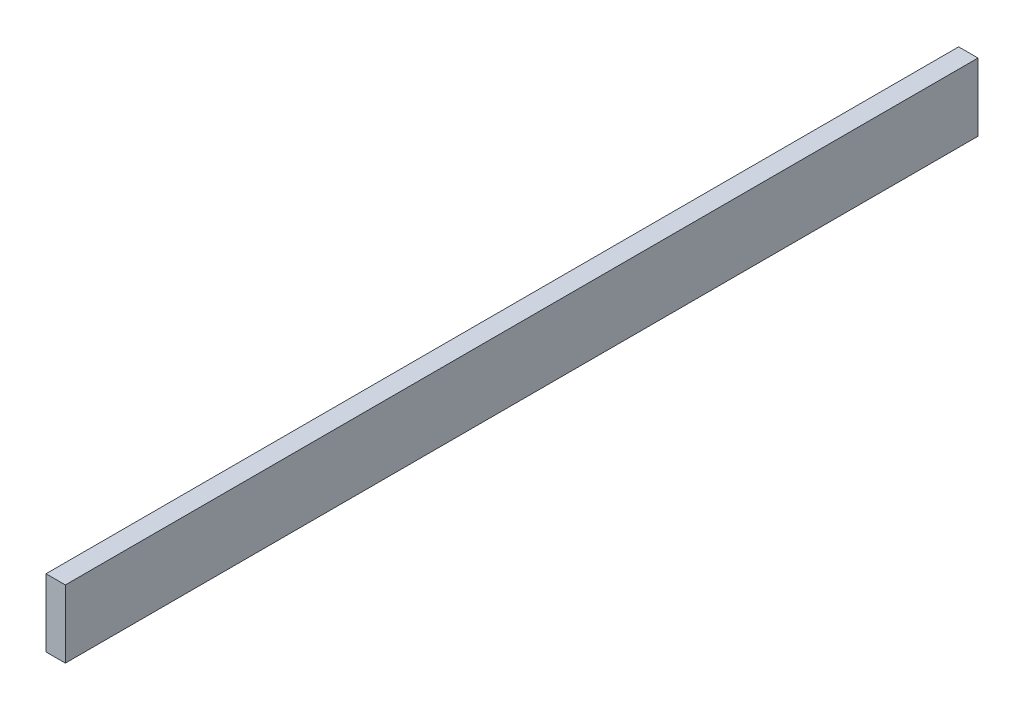
ISO-10303-21;
HEADER;
FILE_DESCRIPTION(('STEP AP214'),'2;1');
FILE_NAME('part.step','',(''),(''),'','','');
FILE_SCHEMA(('AUTOMOTIVE_DESIGN { 1 0 10303 214 1 1 1 1 }'));
ENDSEC;
DATA;
#1=APPLICATION_CONTEXT('core data for automotive mechanical design processes');
#2=APPLICATION_PROTOCOL_DEFINITION('international standard','automotive_design',2000,#1);
#3=PRODUCT_CONTEXT('',#1,'mechanical');
#4=PRODUCT('Part','Part','',(#3));
#5=PRODUCT_RELATED_PRODUCT_CATEGORY('part','',(#4));
#6=PRODUCT_DEFINITION_FORMATION('','',#4);
#7=PRODUCT_DEFINITION_CONTEXT('part definition',#1,'design');
#8=PRODUCT_DEFINITION('design','',#6,#7);
#9=PRODUCT_DEFINITION_SHAPE('','',#8);
#10=(LENGTH_UNIT() NAMED_UNIT(*) SI_UNIT(.MILLI.,.METRE.));
#11=(NAMED_UNIT(*) PLANE_ANGLE_UNIT() SI_UNIT($,.RADIAN.));
#12=(NAMED_UNIT(*) SI_UNIT($,.STERADIAN.) SOLID_ANGLE_UNIT());
#13=UNCERTAINTY_MEASURE_WITH_UNIT(LENGTH_MEASURE(1.E-05),#10,'distance_accuracy_value','');
#14=(GEOMETRIC_REPRESENTATION_CONTEXT(3) GLOBAL_UNCERTAINTY_ASSIGNED_CONTEXT((#13)) GLOBAL_UNIT_ASSIGNED_CONTEXT((#10,
#11,#12)) REPRESENTATION_CONTEXT('',''));
#15=CARTESIAN_POINT('',(0.,0.,0.));
#16=DIRECTION('',(0.,0.,1.));
#17=DIRECTION('',(1.,0.,0.));
#18=AXIS2_PLACEMENT_3D('',#15,#16,#17);
#19=CARTESIAN_POINT('',(714.,1528.,-660.));
#20=DIRECTION('',(-1.,0.,0.));
#21=DIRECTION('',(0.,0.,1.));
#22=AXIS2_PLACEMENT_3D('',#19,#20,#21);
#23=PLANE('',#22);
#24=DIRECTION('',(0.,-1.,0.));
#25=VECTOR('',#24,1.);
#26=CARTESIAN_POINT('',(714.,1528.,0.));
#27=LINE('',#26,#25);
#28=CARTESIAN_POINT('',(714.,1577.,0.));
#29=VERTEX_POINT('',#28);
#30=CARTESIAN_POINT('',(714.,1528.,0.));
#31=VERTEX_POINT('',#30);
#32=EDGE_CURVE('E103',#29,#31,#27,.T.);
#33=ORIENTED_EDGE('',*,*,#32,.F.);
#34=DIRECTION('',(0.,0.,1.));
#35=VECTOR('',#34,1.);
#36=CARTESIAN_POINT('',(714.,1577.,-660.));
#37=LINE('',#36,#35);
#38=CARTESIAN_POINT('',(714.,1577.,-660.));
#39=VERTEX_POINT('',#38);
#40=EDGE_CURVE('E11',#39,#29,#37,.T.);
#41=ORIENTED_EDGE('',*,*,#40,.F.);
#42=DIRECTION('',(0.,-1.,0.));
#43=VECTOR('',#42,1.);
#44=CARTESIAN_POINT('',(714.,1528.,-660.));
#45=LINE('',#44,#43);
#46=CARTESIAN_POINT('',(714.,1528.,-660.));
#47=VERTEX_POINT('',#46);
#48=EDGE_CURVE('E97',#39,#47,#45,.T.);
#49=ORIENTED_EDGE('',*,*,#48,.T.);
#50=DIRECTION('',(0.,0.,1.));
#51=VECTOR('',#50,1.);
#52=CARTESIAN_POINT('',(714.,1528.,-660.));
#53=LINE('',#52,#51);
#54=EDGE_CURVE('E42',#47,#31,#53,.T.);
#55=ORIENTED_EDGE('',*,*,#54,.T.);
#56=EDGE_LOOP('',(#33,#41,#49,#55));
#57=FACE_BOUND('',#56,.T.);
#58=ADVANCED_FACE('F39',(#57),#23,.T.);
#59=CARTESIAN_POINT('',(714.,1577.,-660.));
#60=DIRECTION('',(0.,1.,0.));
#61=DIRECTION('',(0.,0.,1.));
#62=AXIS2_PLACEMENT_3D('',#59,#60,#61);
#63=PLANE('',#62);
#64=DIRECTION('',(-1.,0.,0.));
#65=VECTOR('',#64,1.);
#66=CARTESIAN_POINT('',(714.,1577.,0.));
#67=LINE('',#66,#65);
#68=CARTESIAN_POINT('',(728.,1577.,0.));
#69=VERTEX_POINT('',#68);
#70=EDGE_CURVE('E99',#69,#29,#67,.T.);
#71=ORIENTED_EDGE('',*,*,#70,.F.);
#72=DIRECTION('',(0.,0.,1.));
#73=VECTOR('',#72,1.);
#74=CARTESIAN_POINT('',(728.,1577.,-660.));
#75=LINE('',#74,#73);
#76=CARTESIAN_POINT('',(728.,1577.,-660.));
#77=VERTEX_POINT('',#76);
#78=EDGE_CURVE('E48',#77,#69,#75,.T.);
#79=ORIENTED_EDGE('',*,*,#78,.F.);
#80=DIRECTION('',(-1.,0.,0.));
#81=VECTOR('',#80,1.);
#82=CARTESIAN_POINT('',(714.,1577.,-660.));
#83=LINE('',#82,#81);
#84=EDGE_CURVE('E94',#77,#39,#83,.T.);
#85=ORIENTED_EDGE('',*,*,#84,.T.);
#86=ORIENTED_EDGE('',*,*,#40,.T.);
#87=EDGE_LOOP('',(#71,#79,#85,#86));
#88=FACE_BOUND('',#87,.T.);
#89=ADVANCED_FACE('F113',(#88),#63,.T.);
#90=CARTESIAN_POINT('',(728.,1528.,-660.));
#91=DIRECTION('',(1.,0.,0.));
#92=DIRECTION('',(0.,0.,-1.));
#93=AXIS2_PLACEMENT_3D('',#90,#91,#92);
#94=PLANE('',#93);
#95=DIRECTION('',(0.,1.,0.));
#96=VECTOR('',#95,1.);
#97=CARTESIAN_POINT('',(728.,1528.,0.));
#98=LINE('',#97,#96);
#99=CARTESIAN_POINT('',(728.,1528.,0.));
#100=VERTEX_POINT('',#99);
#101=EDGE_CURVE('E89',#100,#69,#98,.T.);
#102=ORIENTED_EDGE('',*,*,#101,.F.);
#103=DIRECTION('',(0.,0.,1.));
#104=VECTOR('',#103,1.);
#105=CARTESIAN_POINT('',(728.,1528.,-660.));
#106=LINE('',#105,#104);
#107=CARTESIAN_POINT('',(728.,1528.,-660.));
#108=VERTEX_POINT('',#107);
#109=EDGE_CURVE('E84',#108,#100,#106,.T.);
#110=ORIENTED_EDGE('',*,*,#109,.F.);
#111=DIRECTION('',(0.,1.,0.));
#112=VECTOR('',#111,1.);
#113=CARTESIAN_POINT('',(728.,1528.,-660.));
#114=LINE('',#113,#112);
#115=EDGE_CURVE('E87',#108,#77,#114,.T.);
#116=ORIENTED_EDGE('',*,*,#115,.T.);
#117=ORIENTED_EDGE('',*,*,#78,.T.);
#118=EDGE_LOOP('',(#102,#110,#116,#117));
#119=FACE_BOUND('',#118,.T.);
#120=ADVANCED_FACE('F86',(#119),#94,.T.);
#121=CARTESIAN_POINT('',(714.,1528.,-660.));
#122=DIRECTION('',(0.,-1.,0.));
#123=DIRECTION('',(0.,0.,-1.));
#124=AXIS2_PLACEMENT_3D('',#121,#122,#123);
#125=PLANE('',#124);
#126=DIRECTION('',(1.,0.,0.));
#127=VECTOR('',#126,1.);
#128=CARTESIAN_POINT('',(714.,1528.,0.));
#129=LINE('',#128,#127);
#130=EDGE_CURVE('E106',#31,#100,#129,.T.);
#131=ORIENTED_EDGE('',*,*,#130,.F.);
#132=ORIENTED_EDGE('',*,*,#54,.F.);
#133=DIRECTION('',(1.,0.,0.));
#134=VECTOR('',#133,1.);
#135=CARTESIAN_POINT('',(714.,1528.,-660.));
#136=LINE('',#135,#134);
#137=EDGE_CURVE('E93',#47,#108,#136,.T.);
#138=ORIENTED_EDGE('',*,*,#137,.T.);
#139=ORIENTED_EDGE('',*,*,#109,.T.);
#140=EDGE_LOOP('',(#131,#132,#138,#139));
#141=FACE_BOUND('',#140,.T.);
#142=ADVANCED_FACE('F96',(#141),#125,.T.);
#143=CARTESIAN_POINT('',(0.,0.,-660.));
#144=DIRECTION('',(0.,0.,-1.));
#145=DIRECTION('',(-1.,0.,0.));
#146=AXIS2_PLACEMENT_3D('',#143,#144,#145);
#147=PLANE('',#146);
#148=ORIENTED_EDGE('',*,*,#48,.F.);
#149=ORIENTED_EDGE('',*,*,#84,.F.);
#150=ORIENTED_EDGE('',*,*,#115,.F.);
#151=ORIENTED_EDGE('',*,*,#137,.F.);
#152=EDGE_LOOP('',(#148,#149,#150,#151));
#153=FACE_BOUND('',#152,.T.);
#154=ADVANCED_FACE('F92',(#153),#147,.T.);
#155=CARTESIAN_POINT('',(0.,0.,0.));
#156=DIRECTION('',(0.,0.,-1.));
#157=DIRECTION('',(-1.,0.,0.));
#158=AXIS2_PLACEMENT_3D('',#155,#156,#157);
#159=PLANE('',#158);
#160=ORIENTED_EDGE('',*,*,#32,.T.);
#161=ORIENTED_EDGE('',*,*,#130,.T.);
#162=ORIENTED_EDGE('',*,*,#101,.T.);
#163=ORIENTED_EDGE('',*,*,#70,.T.);
#164=EDGE_LOOP('',(#160,#161,#162,#163));
#165=FACE_BOUND('',#164,.T.);
#166=ADVANCED_FACE('F112',(#165),#159,.F.);
#167=CLOSED_SHELL('',(#58,#89,#120,#142,#154,#166));
#168=MANIFOLD_SOLID_BREP('B2',#167);
#169=ADVANCED_BREP_SHAPE_REPRESENTATION('',(#18,#168),#14);
#170=SHAPE_DEFINITION_REPRESENTATION(#9,#169);
ENDSEC;
END-ISO-10303-21;
